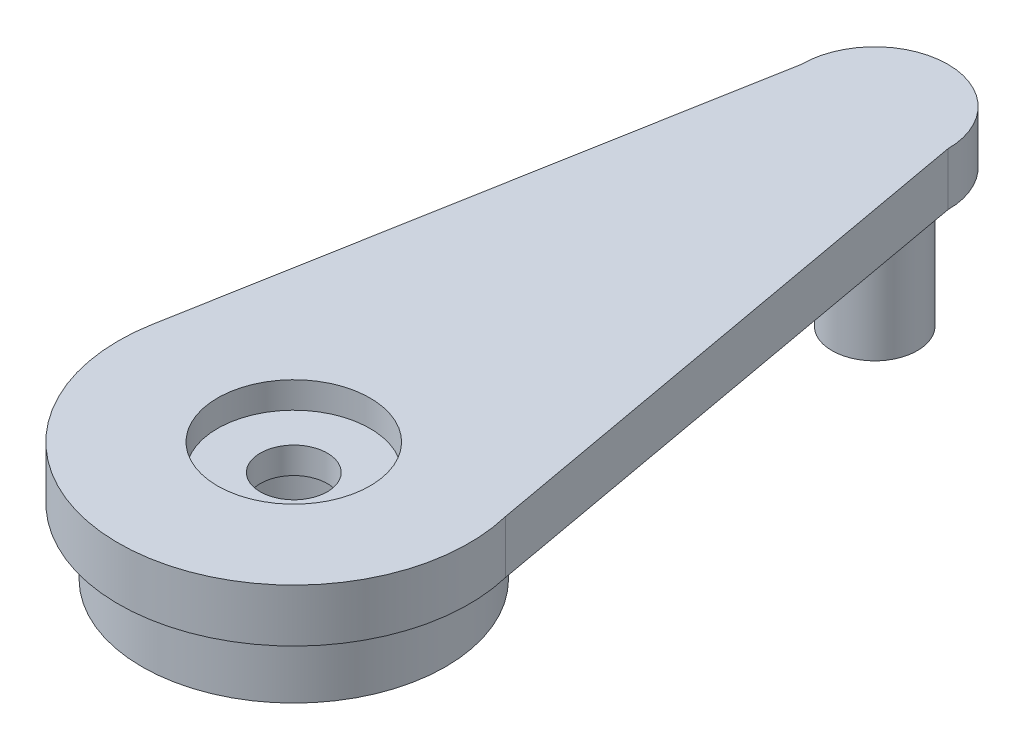
ISO-10303-21;
HEADER;
FILE_DESCRIPTION(('STEP AP214'),'2;1');
FILE_NAME('part.step','',(''),(''),'','','');
FILE_SCHEMA(('AUTOMOTIVE_DESIGN { 1 0 10303 214 1 1 1 1 }'));
ENDSEC;
DATA;
#1=APPLICATION_CONTEXT('core data for automotive mechanical design processes');
#2=APPLICATION_PROTOCOL_DEFINITION('international standard','automotive_design',2000,#1);
#3=PRODUCT_CONTEXT('',#1,'mechanical');
#4=PRODUCT('Part','Part','',(#3));
#5=PRODUCT_RELATED_PRODUCT_CATEGORY('part','',(#4));
#6=PRODUCT_DEFINITION_FORMATION('','',#4);
#7=PRODUCT_DEFINITION_CONTEXT('part definition',#1,'design');
#8=PRODUCT_DEFINITION('design','',#6,#7);
#9=PRODUCT_DEFINITION_SHAPE('','',#8);
#10=(LENGTH_UNIT() NAMED_UNIT(*) SI_UNIT(.MILLI.,.METRE.));
#11=(NAMED_UNIT(*) PLANE_ANGLE_UNIT() SI_UNIT($,.RADIAN.));
#12=(NAMED_UNIT(*) SI_UNIT($,.STERADIAN.) SOLID_ANGLE_UNIT());
#13=UNCERTAINTY_MEASURE_WITH_UNIT(LENGTH_MEASURE(1.E-05),#10,'distance_accuracy_value','');
#14=(GEOMETRIC_REPRESENTATION_CONTEXT(3) GLOBAL_UNCERTAINTY_ASSIGNED_CONTEXT((#13)) GLOBAL_UNIT_ASSIGNED_CONTEXT((#10,
#11,#12)) REPRESENTATION_CONTEXT('',''));
#15=CARTESIAN_POINT('',(0.,0.,0.));
#16=DIRECTION('',(0.,0.,1.));
#17=DIRECTION('',(1.,0.,0.));
#18=AXIS2_PLACEMENT_3D('',#15,#16,#17);
#19=CARTESIAN_POINT('',(0.,0.,0.));
#20=DIRECTION('',(0.,1.,0.));
#21=DIRECTION('',(0.,0.,1.));
#22=AXIS2_PLACEMENT_3D('',#19,#20,#21);
#23=PLANE('',#22);
#24=CARTESIAN_POINT('',(42.4704017276645,0.,36.5469075133499));
#25=DIRECTION('',(0.,1.,0.));
#26=DIRECTION('',(0.,0.,1.));
#27=AXIS2_PLACEMENT_3D('',#24,#25,#26);
#28=CIRCLE('',#27,1.27032101363039);
#29=CARTESIAN_POINT('',(42.4704017276645,0.,37.8172285269803));
#30=VERTEX_POINT('',#29);
#31=EDGE_CURVE('E257',#30,#30,#28,.T.);
#32=ORIENTED_EDGE('',*,*,#31,.T.);
#33=EDGE_LOOP('',(#32));
#34=FACE_BOUND('',#33,.T.);
#35=CARTESIAN_POINT('',(42.4704017276645,0.,36.5469075133499));
#36=DIRECTION('',(0.,-1.,0.));
#37=DIRECTION('',(0.,0.,-1.));
#38=AXIS2_PLACEMENT_3D('',#35,#36,#37);
#39=CIRCLE('',#38,2.5);
#40=CARTESIAN_POINT('',(42.4704017276645,0.,34.0469075133499));
#41=VERTEX_POINT('',#40);
#42=EDGE_CURVE('E268',#41,#41,#39,.T.);
#43=ORIENTED_EDGE('',*,*,#42,.T.);
#44=EDGE_LOOP('',(#43));
#45=FACE_BOUND('',#44,.T.);
#46=ADVANCED_FACE('F71',(#34,#45),#23,.F.);
#47=CARTESIAN_POINT('',(42.4684662839417,2.,14.5469075984849));
#48=DIRECTION('',(0.,-1.,0.));
#49=DIRECTION('',(0.,0.,-1.));
#50=AXIS2_PLACEMENT_3D('',#47,#48,#49);
#51=CYLINDRICAL_SURFACE('',#50,2.77160948428448);
#52=CARTESIAN_POINT('',(42.4684662839417,0.,14.5469075984849));
#53=DIRECTION('',(0.,1.,0.));
#54=DIRECTION('',(0.,0.,1.));
#55=AXIS2_PLACEMENT_3D('',#52,#53,#54);
#56=CIRCLE('',#55,2.77160948428448);
#57=CARTESIAN_POINT('',(45.2400757682262,0.,14.5469075984849));
#58=VERTEX_POINT('',#57);
#59=CARTESIAN_POINT('',(39.6968567996572,0.,14.5469075984849));
#60=VERTEX_POINT('',#59);
#61=EDGE_CURVE('E129',#58,#60,#56,.T.);
#62=ORIENTED_EDGE('',*,*,#61,.T.);
#63=DIRECTION('',(0.,-1.,0.));
#64=VECTOR('',#63,1.);
#65=CARTESIAN_POINT('',(39.6968567996572,2.,14.5469075984849));
#66=LINE('',#65,#64);
#67=CARTESIAN_POINT('',(39.6968567996572,2.,14.5469075984849));
#68=VERTEX_POINT('',#67);
#69=EDGE_CURVE('E126',#68,#60,#66,.T.);
#70=ORIENTED_EDGE('',*,*,#69,.F.);
#71=CARTESIAN_POINT('',(42.4684662839417,2.,14.5469075984849));
#72=DIRECTION('',(0.,1.,0.));
#73=DIRECTION('',(0.,0.,1.));
#74=AXIS2_PLACEMENT_3D('',#71,#72,#73);
#75=CIRCLE('',#74,2.77160948428448);
#76=CARTESIAN_POINT('',(45.2400757682262,2.,14.5469075984849));
#77=VERTEX_POINT('',#76);
#78=EDGE_CURVE('E116',#77,#68,#75,.T.);
#79=ORIENTED_EDGE('',*,*,#78,.F.);
#80=DIRECTION('',(0.,-1.,0.));
#81=VECTOR('',#80,1.);
#82=CARTESIAN_POINT('',(45.2400757682262,2.,14.5469075984849));
#83=LINE('',#82,#81);
#84=EDGE_CURVE('E110',#77,#58,#83,.T.);
#85=ORIENTED_EDGE('',*,*,#84,.T.);
#86=EDGE_LOOP('',(#62,#70,#79,#85));
#87=FACE_BOUND('',#86,.T.);
#88=ADVANCED_FACE('F127',(#87),#51,.T.);
#89=CARTESIAN_POINT('',(40.9871638506006,2.,7.40423474246831));
#90=DIRECTION('',(0.984072010849579,0.,0.177770294094558));
#91=DIRECTION('',(0.177770294094558,0.,-0.984072010849579));
#92=AXIS2_PLACEMENT_3D('',#89,#90,#91);
#93=PLANE('',#92);
#94=DIRECTION('',(-0.177770294094558,0.,0.984072010849579));
#95=VECTOR('',#94,1.);
#96=CARTESIAN_POINT('',(40.9871638506006,0.,7.40423474246831));
#97=LINE('',#96,#95);
#98=CARTESIAN_POINT('',(35.9358541937832,0.,35.3664568714603));
#99=VERTEX_POINT('',#98);
#100=EDGE_CURVE('E144',#60,#99,#97,.T.);
#101=ORIENTED_EDGE('',*,*,#100,.T.);
#102=DIRECTION('',(0.,-1.,0.));
#103=VECTOR('',#102,1.);
#104=CARTESIAN_POINT('',(35.9358541937832,2.,35.3664568714603));
#105=LINE('',#104,#103);
#106=CARTESIAN_POINT('',(35.9358541937832,2.,35.3664568714603));
#107=VERTEX_POINT('',#106);
#108=EDGE_CURVE('E102',#107,#99,#105,.T.);
#109=ORIENTED_EDGE('',*,*,#108,.F.);
#110=DIRECTION('',(-0.177770294094558,0.,0.984072010849579));
#111=VECTOR('',#110,1.);
#112=CARTESIAN_POINT('',(40.9871638506006,2.,7.40423474246831));
#113=LINE('',#112,#111);
#114=EDGE_CURVE('E121',#68,#107,#113,.T.);
#115=ORIENTED_EDGE('',*,*,#114,.F.);
#116=ORIENTED_EDGE('',*,*,#69,.T.);
#117=EDGE_LOOP('',(#101,#109,#115,#116));
#118=FACE_BOUND('',#117,.T.);
#119=ADVANCED_FACE('F134',(#118),#93,.F.);
#120=CARTESIAN_POINT('',(41.2764107283105,2.,-7.4407908754501));
#121=DIRECTION('',(0.984137410568751,0.,-0.177407883474872));
#122=DIRECTION('',(-0.177407883474872,0.,-0.984137410568751));
#123=AXIS2_PLACEMENT_3D('',#120,#121,#122);
#124=PLANE('',#123);
#125=DIRECTION('',(0.177407883474872,0.,0.984137410568751));
#126=VECTOR('',#125,1.);
#127=CARTESIAN_POINT('',(41.2764107283105,0.,-7.4407908754501));
#128=LINE('',#127,#126);
#129=CARTESIAN_POINT('',(48.9243610831508,0.,34.9847987372966));
#130=VERTEX_POINT('',#129);
#131=EDGE_CURVE('E139',#58,#130,#128,.T.);
#132=ORIENTED_EDGE('',*,*,#131,.F.);
#133=ORIENTED_EDGE('',*,*,#84,.F.);
#134=DIRECTION('',(0.177407883474872,0.,0.984137410568751));
#135=VECTOR('',#134,1.);
#136=CARTESIAN_POINT('',(41.2764107283105,2.,-7.4407908754501));
#137=LINE('',#136,#135);
#138=CARTESIAN_POINT('',(48.9243610831508,2.,34.9847987372966));
#139=VERTEX_POINT('',#138);
#140=EDGE_CURVE('E122',#77,#139,#137,.T.);
#141=ORIENTED_EDGE('',*,*,#140,.T.);
#142=DIRECTION('',(0.,-1.,0.));
#143=VECTOR('',#142,1.);
#144=CARTESIAN_POINT('',(48.9243610831508,2.,34.9847987372966));
#145=LINE('',#144,#143);
#146=EDGE_CURVE('E88',#139,#130,#145,.T.);
#147=ORIENTED_EDGE('',*,*,#146,.T.);
#148=EDGE_LOOP('',(#132,#133,#141,#147));
#149=FACE_BOUND('',#148,.T.);
#150=ADVANCED_FACE('F170',(#149),#124,.T.);
#151=CARTESIAN_POINT('',(42.4704017276645,0.,36.5469075133499));
#152=DIRECTION('',(0.,1.,0.));
#153=DIRECTION('',(0.,0.,1.));
#154=AXIS2_PLACEMENT_3D('',#151,#152,#153);
#155=CIRCLE('',#154,5.75);
#156=CARTESIAN_POINT('',(42.4704017276645,0.,42.2969075133499));
#157=VERTEX_POINT('',#156);
#158=EDGE_CURVE('E12',#157,#157,#155,.F.);
#159=ORIENTED_EDGE('',*,*,#158,.F.);
#160=EDGE_LOOP('',(#159));
#161=FACE_BOUND('',#160,.T.);
#162=CARTESIAN_POINT('',(42.4684662839417,0.,14.5469075984849));
#163=DIRECTION('',(0.,1.,0.));
#164=DIRECTION('',(0.,0.,1.));
#165=AXIS2_PLACEMENT_3D('',#162,#163,#164);
#166=CIRCLE('',#165,1.61677219916594);
#167=CARTESIAN_POINT('',(42.4684662839417,0.,16.1636797976509));
#168=VERTEX_POINT('',#167);
#169=EDGE_CURVE('E262',#168,#168,#166,.T.);
#170=ORIENTED_EDGE('',*,*,#169,.T.);
#171=EDGE_LOOP('',(#170));
#172=FACE_BOUND('',#171,.T.);
#173=ORIENTED_EDGE('',*,*,#131,.T.);
#174=CARTESIAN_POINT('',(42.4704017276645,0.,36.5469075133499));
#175=DIRECTION('',(0.,1.,0.));
#176=DIRECTION('',(0.,0.,1.));
#177=AXIS2_PLACEMENT_3D('',#174,#175,#176);
#178=CIRCLE('',#177,6.64031438943158);
#179=EDGE_CURVE('E151',#99,#130,#178,.T.);
#180=ORIENTED_EDGE('',*,*,#179,.F.);
#181=ORIENTED_EDGE('',*,*,#100,.F.);
#182=ORIENTED_EDGE('',*,*,#61,.F.);
#183=EDGE_LOOP('',(#173,#180,#181,#182));
#184=FACE_BOUND('',#183,.T.);
#185=ADVANCED_FACE('F165',(#161,#172,#184),#23,.F.);
#186=CARTESIAN_POINT('',(0.,2.,0.));
#187=DIRECTION('',(0.,1.,0.));
#188=DIRECTION('',(0.,0.,1.));
#189=AXIS2_PLACEMENT_3D('',#186,#187,#188);
#190=PLANE('',#189);
#191=ORIENTED_EDGE('',*,*,#140,.F.);
#192=ORIENTED_EDGE('',*,*,#78,.T.);
#193=ORIENTED_EDGE('',*,*,#114,.T.);
#194=CARTESIAN_POINT('',(42.4704017276645,2.,36.5469075133499));
#195=DIRECTION('',(0.,1.,0.));
#196=DIRECTION('',(0.,0.,1.));
#197=AXIS2_PLACEMENT_3D('',#194,#195,#196);
#198=CIRCLE('',#197,6.64031438943158);
#199=EDGE_CURVE('E142',#107,#139,#198,.T.);
#200=ORIENTED_EDGE('',*,*,#199,.T.);
#201=EDGE_LOOP('',(#191,#192,#193,#200));
#202=FACE_BOUND('',#201,.T.);
#203=CARTESIAN_POINT('',(42.4704017276645,2.,36.5469075133499));
#204=DIRECTION('',(0.,1.,0.));
#205=DIRECTION('',(0.,0.,1.));
#206=AXIS2_PLACEMENT_3D('',#203,#204,#205);
#207=CIRCLE('',#206,2.88709321279634);
#208=CARTESIAN_POINT('',(42.4704017276645,2.,39.4340007261462));
#209=VERTEX_POINT('',#208);
#210=EDGE_CURVE('E148',#209,#209,#207,.T.);
#211=ORIENTED_EDGE('',*,*,#210,.F.);
#212=EDGE_LOOP('',(#211));
#213=FACE_BOUND('',#212,.T.);
#214=ADVANCED_FACE('F118',(#202,#213),#190,.T.);
#215=CARTESIAN_POINT('',(42.4704017276645,2.,36.5469075133499));
#216=DIRECTION('',(0.,-1.,0.));
#217=DIRECTION('',(0.,0.,-1.));
#218=AXIS2_PLACEMENT_3D('',#215,#216,#217);
#219=CYLINDRICAL_SURFACE('',#218,2.88709321279634);
#220=CARTESIAN_POINT('',(42.4704017276645,1.,36.5469075133499));
#221=DIRECTION('',(0.,1.,0.));
#222=DIRECTION('',(0.,0.,1.));
#223=AXIS2_PLACEMENT_3D('',#220,#221,#222);
#224=CIRCLE('',#223,2.88709321279634);
#225=CARTESIAN_POINT('',(42.4704017276645,1.,39.4340007261462));
#226=VERTEX_POINT('',#225);
#227=EDGE_CURVE('E80',#226,#226,#224,.T.);
#228=ORIENTED_EDGE('',*,*,#227,.F.);
#229=EDGE_LOOP('',(#228));
#230=FACE_BOUND('',#229,.T.);
#231=ORIENTED_EDGE('',*,*,#210,.T.);
#232=EDGE_LOOP('',(#231));
#233=FACE_BOUND('',#232,.T.);
#234=ADVANCED_FACE('F159',(#230,#233),#219,.F.);
#235=CARTESIAN_POINT('',(42.4704017276645,2.,36.5469075133499));
#236=DIRECTION('',(0.,-1.,0.));
#237=DIRECTION('',(0.,0.,-1.));
#238=AXIS2_PLACEMENT_3D('',#235,#236,#237);
#239=CYLINDRICAL_SURFACE('',#238,6.64031438943158);
#240=ORIENTED_EDGE('',*,*,#146,.F.);
#241=ORIENTED_EDGE('',*,*,#199,.F.);
#242=ORIENTED_EDGE('',*,*,#108,.T.);
#243=ORIENTED_EDGE('',*,*,#179,.T.);
#244=EDGE_LOOP('',(#240,#241,#242,#243));
#245=FACE_BOUND('',#244,.T.);
#246=ADVANCED_FACE('F73',(#245),#239,.T.);
#247=CARTESIAN_POINT('',(42.4704017276645,1.,36.5469075133499));
#248=DIRECTION('',(0.,-1.,0.));
#249=DIRECTION('',(0.,0.,-1.));
#250=AXIS2_PLACEMENT_3D('',#247,#248,#249);
#251=CYLINDRICAL_SURFACE('',#250,1.27032101363039);
#252=CARTESIAN_POINT('',(42.4704017276645,1.,36.5469075133499));
#253=DIRECTION('',(0.,1.,0.));
#254=DIRECTION('',(0.,0.,1.));
#255=AXIS2_PLACEMENT_3D('',#252,#253,#254);
#256=CIRCLE('',#255,1.27032101363039);
#257=CARTESIAN_POINT('',(42.4704017276645,1.,37.8172285269803));
#258=VERTEX_POINT('',#257);
#259=EDGE_CURVE('E152',#258,#258,#256,.T.);
#260=ORIENTED_EDGE('',*,*,#259,.T.);
#261=EDGE_LOOP('',(#260));
#262=FACE_BOUND('',#261,.T.);
#263=ORIENTED_EDGE('',*,*,#31,.F.);
#264=EDGE_LOOP('',(#263));
#265=FACE_BOUND('',#264,.T.);
#266=ADVANCED_FACE('F162',(#262,#265),#251,.F.);
#267=CARTESIAN_POINT('',(0.,1.,0.));
#268=DIRECTION('',(0.,1.,0.));
#269=DIRECTION('',(0.,0.,1.));
#270=AXIS2_PLACEMENT_3D('',#267,#268,#269);
#271=PLANE('',#270);
#272=ORIENTED_EDGE('',*,*,#259,.F.);
#273=EDGE_LOOP('',(#272));
#274=FACE_BOUND('',#273,.T.);
#275=ORIENTED_EDGE('',*,*,#227,.T.);
#276=EDGE_LOOP('',(#275));
#277=FACE_BOUND('',#276,.T.);
#278=ADVANCED_FACE('F157',(#274,#277),#271,.T.);
#279=CARTESIAN_POINT('',(42.4684662839417,-5.2,14.5469075984849));
#280=DIRECTION('',(0.,1.,0.));
#281=DIRECTION('',(0.,0.,1.));
#282=AXIS2_PLACEMENT_3D('',#279,#280,#281);
#283=CYLINDRICAL_SURFACE('',#282,1.61677219916594);
#284=CARTESIAN_POINT('',(42.4684662839417,-5.2,14.5469075984849));
#285=DIRECTION('',(0.,1.,0.));
#286=DIRECTION('',(0.,0.,1.));
#287=AXIS2_PLACEMENT_3D('',#284,#285,#286);
#288=CIRCLE('',#287,1.61677219916594);
#289=CARTESIAN_POINT('',(42.4684662839417,-5.2,16.1636797976509));
#290=VERTEX_POINT('',#289);
#291=EDGE_CURVE('E258',#290,#290,#288,.T.);
#292=ORIENTED_EDGE('',*,*,#291,.T.);
#293=EDGE_LOOP('',(#292));
#294=FACE_BOUND('',#293,.T.);
#295=ORIENTED_EDGE('',*,*,#169,.F.);
#296=EDGE_LOOP('',(#295));
#297=FACE_BOUND('',#296,.T.);
#298=ADVANCED_FACE('F242',(#294,#297),#283,.T.);
#299=CARTESIAN_POINT('',(0.,-5.2,0.));
#300=DIRECTION('',(0.,1.,0.));
#301=DIRECTION('',(0.,0.,1.));
#302=AXIS2_PLACEMENT_3D('',#299,#300,#301);
#303=PLANE('',#302);
#304=ORIENTED_EDGE('',*,*,#291,.F.);
#305=EDGE_LOOP('',(#304));
#306=FACE_BOUND('',#305,.T.);
#307=ADVANCED_FACE('F213',(#306),#303,.F.);
#308=CARTESIAN_POINT('',(42.4704017276645,-2.5,36.5469075133499));
#309=DIRECTION('',(0.,1.,0.));
#310=DIRECTION('',(0.,0.,1.));
#311=AXIS2_PLACEMENT_3D('',#308,#309,#310);
#312=CYLINDRICAL_SURFACE('',#311,2.5);
#313=CARTESIAN_POINT('',(42.4704017276645,-2.5,36.5469075133499));
#314=DIRECTION('',(0.,-1.,0.));
#315=DIRECTION('',(0.,0.,-1.));
#316=AXIS2_PLACEMENT_3D('',#313,#314,#315);
#317=CIRCLE('',#316,2.5);
#318=CARTESIAN_POINT('',(42.4704017276645,-2.5,34.0469075133499));
#319=VERTEX_POINT('',#318);
#320=EDGE_CURVE('E271',#319,#319,#317,.T.);
#321=ORIENTED_EDGE('',*,*,#320,.T.);
#322=EDGE_LOOP('',(#321));
#323=FACE_BOUND('',#322,.T.);
#324=ORIENTED_EDGE('',*,*,#42,.F.);
#325=EDGE_LOOP('',(#324));
#326=FACE_BOUND('',#325,.T.);
#327=ADVANCED_FACE('F207',(#323,#326),#312,.F.);
#328=CARTESIAN_POINT('',(42.4704017276645,-2.5,36.5469075133499));
#329=DIRECTION('',(0.,1.,0.));
#330=DIRECTION('',(0.,0.,1.));
#331=AXIS2_PLACEMENT_3D('',#328,#329,#330);
#332=CYLINDRICAL_SURFACE('',#331,5.75);
#333=CARTESIAN_POINT('',(42.4704017276645,-2.5,36.5469075133499));
#334=DIRECTION('',(0.,-1.,0.));
#335=DIRECTION('',(0.,0.,-1.));
#336=AXIS2_PLACEMENT_3D('',#333,#334,#335);
#337=CIRCLE('',#336,5.75);
#338=CARTESIAN_POINT('',(42.4704017276645,-2.5,30.7969075133499));
#339=VERTEX_POINT('',#338);
#340=EDGE_CURVE('E266',#339,#339,#337,.T.);
#341=ORIENTED_EDGE('',*,*,#340,.F.);
#342=EDGE_LOOP('',(#341));
#343=FACE_BOUND('',#342,.T.);
#344=ORIENTED_EDGE('',*,*,#158,.T.);
#345=EDGE_LOOP('',(#344));
#346=FACE_BOUND('',#345,.T.);
#347=ADVANCED_FACE('F212',(#343,#346),#332,.T.);
#348=CARTESIAN_POINT('',(0.,-2.5,0.));
#349=DIRECTION('',(0.,-1.,0.));
#350=DIRECTION('',(0.,0.,-1.));
#351=AXIS2_PLACEMENT_3D('',#348,#349,#350);
#352=PLANE('',#351);
#353=ORIENTED_EDGE('',*,*,#320,.F.);
#354=EDGE_LOOP('',(#353));
#355=FACE_BOUND('',#354,.T.);
#356=ORIENTED_EDGE('',*,*,#340,.T.);
#357=EDGE_LOOP('',(#356));
#358=FACE_BOUND('',#357,.T.);
#359=ADVANCED_FACE('F224',(#355,#358),#352,.T.);
#360=CLOSED_SHELL('',(#46,#88,#119,#150,#185,#214,#234,#246,#266,#278,#298,#307,#327,#347,#359));
#361=MANIFOLD_SOLID_BREP('B2',#360);
#362=ADVANCED_BREP_SHAPE_REPRESENTATION('',(#18,#361),#14);
#363=SHAPE_DEFINITION_REPRESENTATION(#9,#362);
ENDSEC;
END-ISO-10303-21;
